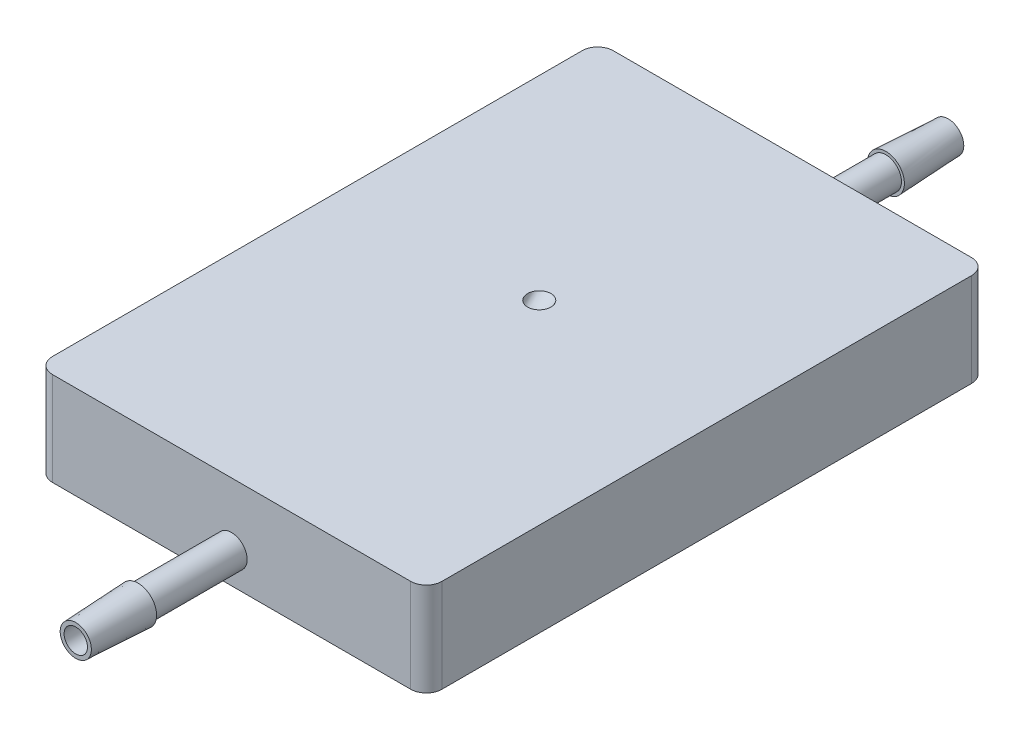
ISO-10303-21;
HEADER;
FILE_DESCRIPTION(('STEP AP214'),'2;1');
FILE_NAME('part.step','',(''),(''),'','','');
FILE_SCHEMA(('AUTOMOTIVE_DESIGN { 1 0 10303 214 1 1 1 1 }'));
ENDSEC;
DATA;
#1=APPLICATION_CONTEXT('core data for automotive mechanical design processes');
#2=APPLICATION_PROTOCOL_DEFINITION('international standard','automotive_design',2000,#1);
#3=PRODUCT_CONTEXT('',#1,'mechanical');
#4=PRODUCT('Part','Part','',(#3));
#5=PRODUCT_RELATED_PRODUCT_CATEGORY('part','',(#4));
#6=PRODUCT_DEFINITION_FORMATION('','',#4);
#7=PRODUCT_DEFINITION_CONTEXT('part definition',#1,'design');
#8=PRODUCT_DEFINITION('design','',#6,#7);
#9=PRODUCT_DEFINITION_SHAPE('','',#8);
#10=(LENGTH_UNIT() NAMED_UNIT(*) SI_UNIT(.MILLI.,.METRE.));
#11=(NAMED_UNIT(*) PLANE_ANGLE_UNIT() SI_UNIT($,.RADIAN.));
#12=(NAMED_UNIT(*) SI_UNIT($,.STERADIAN.) SOLID_ANGLE_UNIT());
#13=UNCERTAINTY_MEASURE_WITH_UNIT(LENGTH_MEASURE(1.E-05),#10,'distance_accuracy_value','');
#14=(GEOMETRIC_REPRESENTATION_CONTEXT(3) GLOBAL_UNCERTAINTY_ASSIGNED_CONTEXT((#13)) GLOBAL_UNIT_ASSIGNED_CONTEXT((#10,
#11,#12)) REPRESENTATION_CONTEXT('',''));
#15=CARTESIAN_POINT('',(0.,0.,0.));
#16=DIRECTION('',(0.,0.,1.));
#17=DIRECTION('',(1.,0.,0.));
#18=AXIS2_PLACEMENT_3D('',#15,#16,#17);
#19=CARTESIAN_POINT('',(0.,-8.07,56.));
#20=DIRECTION('',(0.,0.,-1.));
#21=DIRECTION('',(-1.,0.,0.));
#22=AXIS2_PLACEMENT_3D('',#19,#20,#21);
#23=CYLINDRICAL_SURFACE('',#22,2.);
#24=CARTESIAN_POINT('',(0.,-8.07,36.));
#25=DIRECTION('',(0.,0.,1.));
#26=DIRECTION('',(1.,0.,0.));
#27=AXIS2_PLACEMENT_3D('',#24,#25,#26);
#28=CIRCLE('',#27,2.);
#29=CARTESIAN_POINT('',(2.,-8.07,36.));
#30=VERTEX_POINT('',#29);
#31=EDGE_CURVE('E55',#30,#30,#28,.T.);
#32=ORIENTED_EDGE('',*,*,#31,.T.);
#33=EDGE_LOOP('',(#32));
#34=FACE_BOUND('',#33,.T.);
#35=CARTESIAN_POINT('',(0.,-8.07,48.));
#36=DIRECTION('',(0.,0.,1.));
#37=DIRECTION('',(1.,0.,0.));
#38=AXIS2_PLACEMENT_3D('',#35,#36,#37);
#39=CIRCLE('',#38,2.);
#40=CARTESIAN_POINT('',(2.,-8.07,48.));
#41=VERTEX_POINT('',#40);
#42=EDGE_CURVE('E12',#41,#41,#39,.T.);
#43=ORIENTED_EDGE('',*,*,#42,.F.);
#44=EDGE_LOOP('',(#43));
#45=FACE_BOUND('',#44,.T.);
#46=ADVANCED_FACE('F49',(#34,#45),#23,.T.);
#47=CARTESIAN_POINT('',(0.,-8.07,36.));
#48=DIRECTION('',(0.,0.,1.));
#49=DIRECTION('',(1.,0.,0.));
#50=AXIS2_PLACEMENT_3D('',#47,#48,#49);
#51=PLANE('',#50);
#52=CARTESIAN_POINT('',(0.,-8.07,36.));
#53=DIRECTION('',(0.,0.,1.));
#54=DIRECTION('',(1.,0.,0.));
#55=AXIS2_PLACEMENT_3D('',#52,#53,#54);
#56=CIRCLE('',#55,1.5);
#57=CARTESIAN_POINT('',(1.5,-8.07,36.));
#58=VERTEX_POINT('',#57);
#59=EDGE_CURVE('E70',#58,#58,#56,.T.);
#60=ORIENTED_EDGE('',*,*,#59,.T.);
#61=EDGE_LOOP('',(#60));
#62=FACE_BOUND('',#61,.T.);
#63=ORIENTED_EDGE('',*,*,#31,.F.);
#64=EDGE_LOOP('',(#63));
#65=FACE_BOUND('',#64,.T.);
#66=ADVANCED_FACE('F88',(#62,#65),#51,.F.);
#67=CARTESIAN_POINT('',(0.,-8.07,48.));
#68=DIRECTION('',(0.,0.,1.));
#69=DIRECTION('',(1.,0.,0.));
#70=AXIS2_PLACEMENT_3D('',#67,#68,#69);
#71=PLANE('',#70);
#72=ORIENTED_EDGE('',*,*,#42,.T.);
#73=EDGE_LOOP('',(#72));
#74=FACE_BOUND('',#73,.T.);
#75=CARTESIAN_POINT('',(0.,-8.07,48.));
#76=DIRECTION('',(0.,0.,1.));
#77=DIRECTION('',(1.,0.,0.));
#78=AXIS2_PLACEMENT_3D('',#75,#76,#77);
#79=CIRCLE('',#78,2.375);
#80=CARTESIAN_POINT('',(2.375,-8.07,48.));
#81=VERTEX_POINT('',#80);
#82=EDGE_CURVE('E63',#81,#81,#79,.T.);
#83=ORIENTED_EDGE('',*,*,#82,.F.);
#84=EDGE_LOOP('',(#83));
#85=FACE_BOUND('',#84,.T.);
#86=ADVANCED_FACE('F77',(#74,#85),#71,.F.);
#87=CARTESIAN_POINT('',(0.,-8.07,56.));
#88=DIRECTION('',(0.,0.,-1.));
#89=DIRECTION('',(-1.,0.,0.));
#90=AXIS2_PLACEMENT_3D('',#87,#88,#89);
#91=CONICAL_SURFACE('',#90,2.,0.0468407129159696);
#92=ORIENTED_EDGE('',*,*,#82,.T.);
#93=EDGE_LOOP('',(#92));
#94=FACE_BOUND('',#93,.T.);
#95=CARTESIAN_POINT('',(0.,-8.07,56.));
#96=DIRECTION('',(0.,0.,1.));
#97=DIRECTION('',(1.,0.,0.));
#98=AXIS2_PLACEMENT_3D('',#95,#96,#97);
#99=CIRCLE('',#98,2.);
#100=CARTESIAN_POINT('',(2.,-8.07,56.));
#101=VERTEX_POINT('',#100);
#102=EDGE_CURVE('E59',#101,#101,#99,.T.);
#103=ORIENTED_EDGE('',*,*,#102,.F.);
#104=EDGE_LOOP('',(#103));
#105=FACE_BOUND('',#104,.T.);
#106=ADVANCED_FACE('F87',(#94,#105),#91,.T.);
#107=CARTESIAN_POINT('',(0.,-8.07,56.));
#108=DIRECTION('',(0.,0.,1.));
#109=DIRECTION('',(1.,0.,0.));
#110=AXIS2_PLACEMENT_3D('',#107,#108,#109);
#111=PLANE('',#110);
#112=CARTESIAN_POINT('',(0.,-8.07,56.));
#113=DIRECTION('',(0.,0.,1.));
#114=DIRECTION('',(1.,0.,0.));
#115=AXIS2_PLACEMENT_3D('',#112,#113,#114);
#116=CIRCLE('',#115,1.5);
#117=CARTESIAN_POINT('',(1.5,-8.07,56.));
#118=VERTEX_POINT('',#117);
#119=EDGE_CURVE('E106',#118,#118,#116,.T.);
#120=ORIENTED_EDGE('',*,*,#119,.F.);
#121=EDGE_LOOP('',(#120));
#122=FACE_BOUND('',#121,.T.);
#123=ORIENTED_EDGE('',*,*,#102,.T.);
#124=EDGE_LOOP('',(#123));
#125=FACE_BOUND('',#124,.T.);
#126=ADVANCED_FACE('F93',(#122,#125),#111,.T.);
#127=CARTESIAN_POINT('',(0.,-8.07,-56.00002));
#128=DIRECTION('',(0.,0.,1.));
#129=DIRECTION('',(1.,0.,0.));
#130=AXIS2_PLACEMENT_3D('',#127,#128,#129);
#131=CYLINDRICAL_SURFACE('',#130,1.5);
#132=CARTESIAN_POINT('',(1.5,-8.07,56.));
#133=CARTESIAN_POINT('',(1.5,-8.07,55.7916666666667));
#134=CARTESIAN_POINT('',(1.5,-8.07,55.5833333333333));
#135=CARTESIAN_POINT('',(1.5,-8.07,55.1666666666667));
#136=CARTESIAN_POINT('',(1.5,-8.07,54.9583333333333));
#137=CARTESIAN_POINT('',(1.5,-8.07,54.5416666666667));
#138=CARTESIAN_POINT('',(1.5,-8.07,54.3333333333333));
#139=CARTESIAN_POINT('',(1.5,-8.07,53.9166666666667));
#140=CARTESIAN_POINT('',(1.5,-8.07,53.7083333333333));
#141=CARTESIAN_POINT('',(1.5,-8.07,53.2916666666667));
#142=CARTESIAN_POINT('',(1.5,-8.07,53.0833333333333));
#143=CARTESIAN_POINT('',(1.5,-8.07,52.6666666666667));
#144=CARTESIAN_POINT('',(1.5,-8.07,52.4583333333333));
#145=CARTESIAN_POINT('',(1.5,-8.07,52.0416666666667));
#146=CARTESIAN_POINT('',(1.5,-8.07,51.8333333333333));
#147=CARTESIAN_POINT('',(1.5,-8.07,51.4166666666667));
#148=CARTESIAN_POINT('',(1.5,-8.07,51.2083333333333));
#149=CARTESIAN_POINT('',(1.5,-8.07,50.7916666666667));
#150=CARTESIAN_POINT('',(1.5,-8.07,50.5833333333333));
#151=CARTESIAN_POINT('',(1.5,-8.07,50.1666666666667));
#152=CARTESIAN_POINT('',(1.5,-8.07,49.9583333333333));
#153=CARTESIAN_POINT('',(1.5,-8.07,49.5416666666667));
#154=CARTESIAN_POINT('',(1.5,-8.07,49.3333333333333));
#155=CARTESIAN_POINT('',(1.5,-8.07,48.9166666666667));
#156=CARTESIAN_POINT('',(1.5,-8.07,48.7083333333333));
#157=CARTESIAN_POINT('',(1.5,-8.07,48.2916666666667));
#158=CARTESIAN_POINT('',(1.5,-8.07,48.0833333333333));
#159=CARTESIAN_POINT('',(1.5,-8.07,47.6666666666667));
#160=CARTESIAN_POINT('',(1.5,-8.07,47.4583333333333));
#161=CARTESIAN_POINT('',(1.5,-8.07,47.0416666666667));
#162=CARTESIAN_POINT('',(1.5,-8.07,46.8333333333333));
#163=CARTESIAN_POINT('',(1.5,-8.07,46.4166666666667));
#164=CARTESIAN_POINT('',(1.5,-8.07,46.2083333333333));
#165=CARTESIAN_POINT('',(1.5,-8.07,45.7916666666667));
#166=CARTESIAN_POINT('',(1.5,-8.07,45.5833333333333));
#167=CARTESIAN_POINT('',(1.5,-8.07,45.1666666666667));
#168=CARTESIAN_POINT('',(1.5,-8.07,44.9583333333333));
#169=CARTESIAN_POINT('',(1.5,-8.07,44.5416666666667));
#170=CARTESIAN_POINT('',(1.5,-8.07,44.3333333333333));
#171=CARTESIAN_POINT('',(1.5,-8.07,43.9166666666667));
#172=CARTESIAN_POINT('',(1.5,-8.07,43.7083333333333));
#173=CARTESIAN_POINT('',(1.5,-8.07,43.2916666666667));
#174=CARTESIAN_POINT('',(1.5,-8.07,43.0833333333333));
#175=CARTESIAN_POINT('',(1.5,-8.07,42.6666666666667));
#176=CARTESIAN_POINT('',(1.5,-8.07,42.4583333333333));
#177=CARTESIAN_POINT('',(1.5,-8.07,42.0416666666667));
#178=CARTESIAN_POINT('',(1.5,-8.07,41.8333333333333));
#179=CARTESIAN_POINT('',(1.5,-8.07,41.4166666666667));
#180=CARTESIAN_POINT('',(1.5,-8.07,41.2083333333333));
#181=CARTESIAN_POINT('',(1.5,-8.07,40.7916666666667));
#182=CARTESIAN_POINT('',(1.5,-8.07,40.5833333333333));
#183=CARTESIAN_POINT('',(1.5,-8.07,40.1666666666667));
#184=CARTESIAN_POINT('',(1.5,-8.07,39.9583333333333));
#185=CARTESIAN_POINT('',(1.5,-8.07,39.5416666666667));
#186=CARTESIAN_POINT('',(1.5,-8.07,39.3333333333333));
#187=CARTESIAN_POINT('',(1.5,-8.07,38.9166666666667));
#188=CARTESIAN_POINT('',(1.5,-8.07,38.7083333333333));
#189=CARTESIAN_POINT('',(1.5,-8.07,38.2916666666667));
#190=CARTESIAN_POINT('',(1.5,-8.07,38.0833333333333));
#191=CARTESIAN_POINT('',(1.5,-8.07,37.6666666666667));
#192=CARTESIAN_POINT('',(1.5,-8.07,37.4583333333333));
#193=CARTESIAN_POINT('',(1.5,-8.07,37.0416666666667));
#194=CARTESIAN_POINT('',(1.5,-8.07,36.8333333333333));
#195=CARTESIAN_POINT('',(1.5,-8.07,36.4166666666667));
#196=CARTESIAN_POINT('',(1.5,-8.07,36.2083333333333));
#197=CARTESIAN_POINT('',(1.5,-8.07,36.));
#198=B_SPLINE_CURVE_WITH_KNOTS('',3,(#132,#133,#134,#135,#136,#137,#138,#139,#140,#141,#142,
#143,#144,#145,#146,#147,#148,#149,#150,#151,#152,#153,#154,#155,#156,#157,#158,#159,#160,#161,
#162,#163,#164,#165,#166,#167,#168,#169,#170,#171,#172,#173,#174,#175,#176,#177,#178,#179,#180,
#181,#182,#183,#184,#185,#186,#187,#188,#189,#190,#191,#192,#193,#194,#195,#196,#197),
.UNSPECIFIED.,.F.,.F.,(4,2,2,2,2,2,2,2,2,2,2,2,2,2,2,2,2,2,2,2,2,2,2,2,2,2,2,2,2,2,2,2,4),(0.,
0.625000000000001,1.25,1.875,2.5,3.125,3.75,4.375,5.,5.62499999999999,6.24999999999999,
6.87499999999999,7.49999999999999,8.12499999999999,8.74999999999999,9.37499999999999,
9.99999999999999,10.625,11.25,11.875,12.5,13.125,13.75,14.375,15.,15.625,16.25,16.875,17.5,
18.125,18.75,19.375,20.),.UNSPECIFIED.);
#199=EDGE_CURVE('BSEAM89',#118,#58,#198,.T.);
#200=ORIENTED_EDGE('',*,*,#119,.T.);
#201=ORIENTED_EDGE('',*,*,#59,.F.);
#202=ORIENTED_EDGE('',*,*,#199,.T.);
#203=ORIENTED_EDGE('',*,*,#199,.F.);
#204=EDGE_LOOP('',(#200,#202,#201,#203));
#205=FACE_BOUND('',#204,.T.);
#206=ADVANCED_FACE('F89',(#205),#131,.F.);
#207=CLOSED_SHELL('',(#46,#66,#86,#106,#126,#206));
#208=MANIFOLD_SOLID_BREP('B2',#207);
#209=CARTESIAN_POINT('',(0.,-7.07106781186549,3.57106781186547));
#210=DIRECTION('',(0.,-1.,0.));
#211=DIRECTION('',(0.,0.,-1.));
#212=AXIS2_PLACEMENT_3D('',#209,#210,#211);
#213=PLANE('',#212);
#214=CARTESIAN_POINT('',(0.,-7.07106781186549,3.57106781186547));
#215=DIRECTION('',(0.,-1.,0.));
#216=DIRECTION('',(0.,0.,-1.));
#217=AXIS2_PLACEMENT_3D('',#214,#215,#216);
#218=CIRCLE('',#217,1.5);
#219=CARTESIAN_POINT('',(1.11898815163914,-7.07106781186549,2.57213562373096));
#220=VERTEX_POINT('',#219);
#221=CARTESIAN_POINT('',(1.11898815163914,-7.07106781186549,4.56999999999999));
#222=VERTEX_POINT('',#221);
#223=EDGE_CURVE('E253',#220,#222,#218,.T.);
#224=ORIENTED_EDGE('',*,*,#223,.F.);
#225=DIRECTION('',(0.,0.,1.));
#226=VECTOR('',#225,1.);
#227=CARTESIAN_POINT('',(1.11898815163914,-7.07106781186549,-56.00002));
#228=LINE('',#227,#226);
#229=EDGE_CURVE('E244',#220,#222,#228,.T.);
#230=ORIENTED_EDGE('',*,*,#229,.T.);
#231=EDGE_LOOP('',(#224,#230));
#232=FACE_BOUND('',#231,.T.);
#233=ADVANCED_FACE('F163',(#232),#213,.F.);
#234=CARTESIAN_POINT('',(0.,-12.,36.));
#235=DIRECTION('',(0.,0.,1.));
#236=DIRECTION('',(1.,0.,0.));
#237=AXIS2_PLACEMENT_3D('',#234,#235,#236);
#238=PLANE('',#237);
#239=CARTESIAN_POINT('',(0.,-8.07,36.));
#240=DIRECTION('',(0.,0.,1.));
#241=DIRECTION('',(1.,0.,0.));
#242=AXIS2_PLACEMENT_3D('',#239,#240,#241);
#243=CIRCLE('',#242,1.5);
#244=CARTESIAN_POINT('',(1.5,-8.07,36.));
#245=VERTEX_POINT('',#244);
#246=EDGE_CURVE('E343',#245,#245,#243,.T.);
#247=ORIENTED_EDGE('',*,*,#246,.F.);
#248=EDGE_LOOP('',(#247));
#249=FACE_BOUND('',#248,.T.);
#250=DIRECTION('',(1.,0.,0.));
#251=VECTOR('',#250,1.);
#252=CARTESIAN_POINT('',(0.,-12.,36.));
#253=LINE('',#252,#251);
#254=CARTESIAN_POINT('',(-23.,-12.,36.));
#255=VERTEX_POINT('',#254);
#256=CARTESIAN_POINT('',(23.,-12.,36.));
#257=VERTEX_POINT('',#256);
#258=EDGE_CURVE('E274',#255,#257,#253,.T.);
#259=ORIENTED_EDGE('',*,*,#258,.T.);
#260=DIRECTION('',(0.,1.,0.));
#261=VECTOR('',#260,1.);
#262=CARTESIAN_POINT('',(23.,-12.,36.));
#263=LINE('',#262,#261);
#264=CARTESIAN_POINT('',(23.,0.,36.));
#265=VERTEX_POINT('',#264);
#266=EDGE_CURVE('E172',#257,#265,#263,.T.);
#267=ORIENTED_EDGE('',*,*,#266,.T.);
#268=DIRECTION('',(1.,0.,0.));
#269=VECTOR('',#268,1.);
#270=CARTESIAN_POINT('',(0.,0.,36.));
#271=LINE('',#270,#269);
#272=CARTESIAN_POINT('',(-23.,0.,36.));
#273=VERTEX_POINT('',#272);
#274=EDGE_CURVE('E262',#273,#265,#271,.T.);
#275=ORIENTED_EDGE('',*,*,#274,.F.);
#276=DIRECTION('',(0.,1.,0.));
#277=VECTOR('',#276,1.);
#278=CARTESIAN_POINT('',(-23.,-12.,36.));
#279=LINE('',#278,#277);
#280=EDGE_CURVE('E389',#273,#255,#279,.F.);
#281=ORIENTED_EDGE('',*,*,#280,.T.);
#282=EDGE_LOOP('',(#259,#267,#275,#281));
#283=FACE_BOUND('',#282,.T.);
#284=ADVANCED_FACE('F295',(#249,#283),#238,.T.);
#285=CARTESIAN_POINT('',(-25.,-12.,0.));
#286=DIRECTION('',(1.,0.,0.));
#287=DIRECTION('',(0.,0.,-1.));
#288=AXIS2_PLACEMENT_3D('',#285,#286,#287);
#289=PLANE('',#288);
#290=DIRECTION('',(0.,0.,-1.));
#291=VECTOR('',#290,1.);
#292=CARTESIAN_POINT('',(-25.,0.,0.));
#293=LINE('',#292,#291);
#294=CARTESIAN_POINT('',(-25.,0.,34.));
#295=VERTEX_POINT('',#294);
#296=CARTESIAN_POINT('',(-25.,0.,-34.));
#297=VERTEX_POINT('',#296);
#298=EDGE_CURVE('E392',#295,#297,#293,.T.);
#299=ORIENTED_EDGE('',*,*,#298,.T.);
#300=DIRECTION('',(0.,1.,0.));
#301=VECTOR('',#300,1.);
#302=CARTESIAN_POINT('',(-25.,-12.,-34.));
#303=LINE('',#302,#301);
#304=CARTESIAN_POINT('',(-25.,-12.,-34.));
#305=VERTEX_POINT('',#304);
#306=EDGE_CURVE('E435',#297,#305,#303,.F.);
#307=ORIENTED_EDGE('',*,*,#306,.T.);
#308=DIRECTION('',(0.,0.,-1.));
#309=VECTOR('',#308,1.);
#310=CARTESIAN_POINT('',(-25.,-12.,0.));
#311=LINE('',#310,#309);
#312=CARTESIAN_POINT('',(-25.,-12.,34.));
#313=VERTEX_POINT('',#312);
#314=EDGE_CURVE('E416',#313,#305,#311,.T.);
#315=ORIENTED_EDGE('',*,*,#314,.F.);
#316=DIRECTION('',(0.,1.,0.));
#317=VECTOR('',#316,1.);
#318=CARTESIAN_POINT('',(-25.,0.,34.));
#319=LINE('',#318,#317);
#320=EDGE_CURVE('E432',#313,#295,#319,.T.);
#321=ORIENTED_EDGE('',*,*,#320,.T.);
#322=EDGE_LOOP('',(#299,#307,#315,#321));
#323=FACE_BOUND('',#322,.T.);
#324=ADVANCED_FACE('F291',(#323),#289,.F.);
#325=CARTESIAN_POINT('',(0.,-12.,-36.));
#326=DIRECTION('',(0.,0.,1.));
#327=DIRECTION('',(1.,0.,0.));
#328=AXIS2_PLACEMENT_3D('',#325,#326,#327);
#329=PLANE('',#328);
#330=CARTESIAN_POINT('',(0.,-8.07,-36.));
#331=DIRECTION('',(0.,0.,1.));
#332=DIRECTION('',(1.,0.,0.));
#333=AXIS2_PLACEMENT_3D('',#330,#331,#332);
#334=CIRCLE('',#333,2.);
#335=CARTESIAN_POINT('',(2.,-8.07,-36.));
#336=VERTEX_POINT('',#335);
#337=EDGE_CURVE('E47',#336,#336,#334,.F.);
#338=ORIENTED_EDGE('',*,*,#337,.F.);
#339=EDGE_LOOP('',(#338));
#340=FACE_BOUND('',#339,.T.);
#341=DIRECTION('',(1.,0.,0.));
#342=VECTOR('',#341,1.);
#343=CARTESIAN_POINT('',(0.,-12.,-36.));
#344=LINE('',#343,#342);
#345=CARTESIAN_POINT('',(-23.,-12.,-36.));
#346=VERTEX_POINT('',#345);
#347=CARTESIAN_POINT('',(23.,-12.,-36.));
#348=VERTEX_POINT('',#347);
#349=EDGE_CURVE('E409',#346,#348,#344,.T.);
#350=ORIENTED_EDGE('',*,*,#349,.F.);
#351=DIRECTION('',(0.,1.,0.));
#352=VECTOR('',#351,1.);
#353=CARTESIAN_POINT('',(-23.,-12.,-36.));
#354=LINE('',#353,#352);
#355=CARTESIAN_POINT('',(-23.,0.,-36.));
#356=VERTEX_POINT('',#355);
#357=EDGE_CURVE('E412',#346,#356,#354,.T.);
#358=ORIENTED_EDGE('',*,*,#357,.T.);
#359=DIRECTION('',(1.,0.,0.));
#360=VECTOR('',#359,1.);
#361=CARTESIAN_POINT('',(0.,0.,-36.));
#362=LINE('',#361,#360);
#363=CARTESIAN_POINT('',(23.,0.,-36.));
#364=VERTEX_POINT('',#363);
#365=EDGE_CURVE('E449',#356,#364,#362,.T.);
#366=ORIENTED_EDGE('',*,*,#365,.T.);
#367=DIRECTION('',(0.,1.,0.));
#368=VECTOR('',#367,1.);
#369=CARTESIAN_POINT('',(23.,-12.,-36.));
#370=LINE('',#369,#368);
#371=EDGE_CURVE('E415',#364,#348,#370,.F.);
#372=ORIENTED_EDGE('',*,*,#371,.T.);
#373=EDGE_LOOP('',(#350,#358,#366,#372));
#374=FACE_BOUND('',#373,.T.);
#375=ADVANCED_FACE('F294',(#340,#374),#329,.F.);
#376=CARTESIAN_POINT('',(25.,-12.,0.));
#377=DIRECTION('',(1.,0.,0.));
#378=DIRECTION('',(0.,0.,-1.));
#379=AXIS2_PLACEMENT_3D('',#376,#377,#378);
#380=PLANE('',#379);
#381=DIRECTION('',(0.,0.,-1.));
#382=VECTOR('',#381,1.);
#383=CARTESIAN_POINT('',(25.,-12.,0.));
#384=LINE('',#383,#382);
#385=CARTESIAN_POINT('',(25.,-12.,34.));
#386=VERTEX_POINT('',#385);
#387=CARTESIAN_POINT('',(25.,-12.,-34.));
#388=VERTEX_POINT('',#387);
#389=EDGE_CURVE('E391',#386,#388,#384,.T.);
#390=ORIENTED_EDGE('',*,*,#389,.T.);
#391=DIRECTION('',(0.,1.,0.));
#392=VECTOR('',#391,1.);
#393=CARTESIAN_POINT('',(25.,0.,-34.));
#394=LINE('',#393,#392);
#395=CARTESIAN_POINT('',(25.,0.,-34.));
#396=VERTEX_POINT('',#395);
#397=EDGE_CURVE('E397',#388,#396,#394,.T.);
#398=ORIENTED_EDGE('',*,*,#397,.T.);
#399=DIRECTION('',(0.,0.,-1.));
#400=VECTOR('',#399,1.);
#401=CARTESIAN_POINT('',(25.,0.,0.));
#402=LINE('',#401,#400);
#403=CARTESIAN_POINT('',(25.,0.,34.));
#404=VERTEX_POINT('',#403);
#405=EDGE_CURVE('E447',#404,#396,#402,.T.);
#406=ORIENTED_EDGE('',*,*,#405,.F.);
#407=DIRECTION('',(0.,1.,0.));
#408=VECTOR('',#407,1.);
#409=CARTESIAN_POINT('',(25.,-12.,34.));
#410=LINE('',#409,#408);
#411=EDGE_CURVE('E442',#404,#386,#410,.F.);
#412=ORIENTED_EDGE('',*,*,#411,.T.);
#413=EDGE_LOOP('',(#390,#398,#406,#412));
#414=FACE_BOUND('',#413,.T.);
#415=ADVANCED_FACE('F286',(#414),#380,.T.);
#416=CARTESIAN_POINT('',(0.,-12.,0.));
#417=DIRECTION('',(0.,1.,0.));
#418=DIRECTION('',(0.,0.,1.));
#419=AXIS2_PLACEMENT_3D('',#416,#417,#418);
#420=PLANE('',#419);
#421=ORIENTED_EDGE('',*,*,#314,.T.);
#422=CARTESIAN_POINT('',(-23.,-12.,-34.));
#423=DIRECTION('',(0.,1.,0.));
#424=DIRECTION('',(0.,0.,1.));
#425=AXIS2_PLACEMENT_3D('',#422,#423,#424);
#426=CIRCLE('',#425,2.);
#427=EDGE_CURVE('E420',#305,#346,#426,.F.);
#428=ORIENTED_EDGE('',*,*,#427,.T.);
#429=ORIENTED_EDGE('',*,*,#349,.T.);
#430=CARTESIAN_POINT('',(23.,-12.,-34.));
#431=DIRECTION('',(0.,1.,0.));
#432=DIRECTION('',(0.,0.,1.));
#433=AXIS2_PLACEMENT_3D('',#430,#431,#432);
#434=CIRCLE('',#433,2.);
#435=EDGE_CURVE('E188',#348,#388,#434,.F.);
#436=ORIENTED_EDGE('',*,*,#435,.T.);
#437=ORIENTED_EDGE('',*,*,#389,.F.);
#438=CARTESIAN_POINT('',(23.,-12.,34.));
#439=DIRECTION('',(0.,1.,0.));
#440=DIRECTION('',(0.,0.,1.));
#441=AXIS2_PLACEMENT_3D('',#438,#439,#440);
#442=CIRCLE('',#441,2.);
#443=EDGE_CURVE('E394',#386,#257,#442,.F.);
#444=ORIENTED_EDGE('',*,*,#443,.T.);
#445=ORIENTED_EDGE('',*,*,#258,.F.);
#446=CARTESIAN_POINT('',(-23.,-12.,34.));
#447=DIRECTION('',(0.,1.,0.));
#448=DIRECTION('',(0.,0.,1.));
#449=AXIS2_PLACEMENT_3D('',#446,#447,#448);
#450=CIRCLE('',#449,2.);
#451=EDGE_CURVE('E437',#255,#313,#450,.F.);
#452=ORIENTED_EDGE('',*,*,#451,.T.);
#453=EDGE_LOOP('',(#421,#428,#429,#436,#437,#444,#445,#452));
#454=FACE_BOUND('',#453,.T.);
#455=ADVANCED_FACE('F282',(#454),#420,.F.);
#456=CARTESIAN_POINT('',(0.,0.,0.));
#457=DIRECTION('',(0.,1.,0.));
#458=DIRECTION('',(0.,0.,1.));
#459=AXIS2_PLACEMENT_3D('',#456,#457,#458);
#460=PLANE('',#459);
#461=CARTESIAN_POINT('',(0.,0.,-4.99999999999999));
#462=CARTESIAN_POINT('',(0.0780814625814367,0.,-4.999997819174));
#463=CARTESIAN_POINT('',(0.156194837180258,0.,-4.99388674339786));
#464=CARTESIAN_POINT('',(0.310568766075918,0.,-4.96957942884071));
#465=CARTESIAN_POINT('',(0.386827564864533,0.,-4.95137216884005));
#466=CARTESIAN_POINT('',(0.541460812921258,0.,-4.90140152427333));
#467=CARTESIAN_POINT('',(0.619529009389053,0.,-4.8686835768798));
#468=CARTESIAN_POINT('',(0.769060109938279,0.,-4.79060585046049));
#469=CARTESIAN_POINT('',(0.840522714355423,0.,-4.74524549828339));
#470=CARTESIAN_POINT('',(0.974819200377668,0.,-4.64317107606942));
#471=CARTESIAN_POINT('',(1.03765320584079,0.,-4.58645716903428));
#472=CARTESIAN_POINT('',(1.15290630501183,0.,-4.46328648096786));
#473=CARTESIAN_POINT('',(1.20532557189621,0.,-4.3968298619705));
#474=CARTESIAN_POINT('',(1.29826350116876,0.,-4.25605904936886));
#475=CARTESIAN_POINT('',(1.33878209527155,0.,-4.18174481068136));
#476=CARTESIAN_POINT('',(1.40676805357938,0.,-4.02736824492183));
#477=CARTESIAN_POINT('',(1.43423535051751,0.,-3.94730588822622));
#478=CARTESIAN_POINT('',(1.47533869888931,0.,-3.78370632167074));
#479=CARTESIAN_POINT('',(1.48897477619881,0.,-3.70016911831201));
#480=CARTESIAN_POINT('',(1.50202866391522,0.,-3.5319912169947));
#481=CARTESIAN_POINT('',(1.50144649440334,0.,-3.44735052059482));
#482=CARTESIAN_POINT('',(1.48608046369324,0.,-3.27936816894603));
#483=CARTESIAN_POINT('',(1.47129659490999,0.,-3.19602651439096));
#484=CARTESIAN_POINT('',(1.42794681627332,0.,-3.03300808865591));
#485=CARTESIAN_POINT('',(1.39938090167607,0.,-2.95333131873741));
#486=CARTESIAN_POINT('',(1.329277937295,0.,-2.79990449325223));
#487=CARTESIAN_POINT('',(1.28774088927041,0.,-2.72615443688173));
#488=CARTESIAN_POINT('',(1.19287477465275,0.,-2.58667457911823));
#489=CARTESIAN_POINT('',(1.13954570891943,0.,-2.52094477714047));
#490=CARTESIAN_POINT('',(1.02260941097157,0.,-2.39937129554527));
#491=CARTESIAN_POINT('',(0.959002178452054,0.,-2.3435276162212));
#492=CARTESIAN_POINT('',(0.823315169208855,0.,-2.24331161973099));
#493=CARTESIAN_POINT('',(0.751235392370483,0.,-2.19893930272014));
#494=CARTESIAN_POINT('',(0.600649428506405,0.,-2.12292563140233));
#495=CARTESIAN_POINT('',(0.522143241499197,0.,-2.09128427705873));
#496=CARTESIAN_POINT('',(0.360933017523727,0.,-2.04163073623709));
#497=CARTESIAN_POINT('',(0.278228980588287,0.,-2.02361854965249));
#498=CARTESIAN_POINT('',(0.110970781472903,0.,-2.00173465699344));
#499=CARTESIAN_POINT('',(0.0264166193111619,0.,-1.99786295077986));
#500=CARTESIAN_POINT('',(-0.14214158937849,0.,-2.00436992495797));
#501=CARTESIAN_POINT('',(-0.22614563589128,0.,-2.01474860574132));
#502=CARTESIAN_POINT('',(-0.391218985967424,0.,-2.04946173495449));
#503=CARTESIAN_POINT('',(-0.472288289425148,0.,-2.07379618388661));
#504=CARTESIAN_POINT('',(-0.629190822929284,0.,-2.13573006325163));
#505=CARTESIAN_POINT('',(-0.705024053496428,0.,-2.17332949236533));
#506=CARTESIAN_POINT('',(-0.849301760195755,0.,-2.26072599052401));
#507=CARTESIAN_POINT('',(-0.917746237118822,0.,-2.31052305826339));
#508=CARTESIAN_POINT('',(-1.04530352889115,0.,-2.42090126143768));
#509=CARTESIAN_POINT('',(-1.1044163408143,0.,-2.48148240025413));
#510=CARTESIAN_POINT('',(-1.21163225108473,0.,-2.6117090304441));
#511=CARTESIAN_POINT('',(-1.25973534664264,0.,-2.68135452411413));
#512=CARTESIAN_POINT('',(-1.34356626354156,0.,-2.82773275956024));
#513=CARTESIAN_POINT('',(-1.37929409503359,0.,-2.90446549552283));
#514=CARTESIAN_POINT('',(-1.43736032342614,0.,-3.06284002547027));
#515=CARTESIAN_POINT('',(-1.45969872426642,0.,-3.14448181801064));
#516=CARTESIAN_POINT('',(-1.49035200766799,0.,-3.31035703210246));
#517=CARTESIAN_POINT('',(-1.49866687047423,0.,-3.3945904573046));
#518=CARTESIAN_POINT('',(-1.50103698330676,0.,-3.56325756039939));
#519=CARTESIAN_POINT('',(-1.4950922540952,0.,-3.6476912380003));
#520=CARTESIAN_POINT('',(-1.46911194804978,0.,-3.81436227427137));
#521=CARTESIAN_POINT('',(-1.44907635003292,0.,-3.89659962963958));
#522=CARTESIAN_POINT('',(-1.39548269468948,0.,-4.0565445572966));
#523=CARTESIAN_POINT('',(-1.36192444327949,0.,-4.1342520645526));
#524=CARTESIAN_POINT('',(-1.28223915813427,0.,-4.28292782899874));
#525=CARTESIAN_POINT('',(-1.23611250411696,0.,-4.35389628970232));
#526=CARTESIAN_POINT('',(-1.13260418417827,0.,-4.48707661900277));
#527=CARTESIAN_POINT('',(-1.07522342812459,0.,-4.5492891947944));
#528=CARTESIAN_POINT('',(-0.950818733008898,0.,-4.66321010723415));
#529=CARTESIAN_POINT('',(-0.883792945978387,0.,-4.71491642631497));
#530=CARTESIAN_POINT('',(-0.741992094516134,0.,-4.80635765737475));
#531=CARTESIAN_POINT('',(-0.667214177825336,0.,-4.84608814189752));
#532=CARTESIAN_POINT('',(-0.512093226880883,0.,-4.91239587394726));
#533=CARTESIAN_POINT('',(-0.4317554326849,0.,-4.93898531921571));
#534=CARTESIAN_POINT('',(-0.292566039841705,0.,-4.97237135906569));
#535=CARTESIAN_POINT('',(-0.234539792646403,0.,-4.98271853485402));
#536=CARTESIAN_POINT('',(-0.117681641889038,0.,-4.99653305933841));
#537=CARTESIAN_POINT('',(-0.0588498849387602,0.,-5.00000164368536));
#538=CARTESIAN_POINT('',(0.,0.,-4.99999999999999));
#539=B_SPLINE_CURVE_WITH_KNOTS('',3,(#461,#462,#463,#464,#465,#466,#467,#468,#469,#470,#471,
#472,#473,#474,#475,#476,#477,#478,#479,#480,#481,#482,#483,#484,#485,#486,#487,#488,#489,#490,
#491,#492,#493,#494,#495,#496,#497,#498,#499,#500,#501,#502,#503,#504,#505,#506,#507,#508,#509,
#510,#511,#512,#513,#514,#515,#516,#517,#518,#519,#520,#521,#522,#523,#524,#525,#526,#527,#528,
#529,#530,#531,#532,#533,#534,#535,#536,#537,#538),.UNSPECIFIED.,.T.,.F.,(4,2,2,2,2,2,2,2,2,2,2,
2,2,2,2,2,2,2,2,2,2,2,2,2,2,2,2,2,2,2,2,2,2,2,2,2,2,2,4),(0.,0.234060069342365,
0.468333691296653,0.721054859125771,0.973787486091065,1.22651648486197,1.4792412808989,
1.73196752702772,1.98469507570354,2.23742215156854,2.49014887049333,2.74287572439778,
2.99560266529155,3.24832957190882,3.50105646009996,3.75378335579051,4.00651025490219,
4.25923715328646,4.5119640496947,4.7646909436165,5.01741784448438,5.2701447544486,
5.52287163927891,5.7755984970576,6.02832543408343,6.28105243513921,6.53377922889095,
6.78650594827929,7.03923302368504,7.29195973111701,7.5446868184775,7.79741753322426,
8.0501406132906,8.30284326970632,8.55559440806732,8.8084388740326,9.06104820249384,
9.23749063529472,9.41390136959916),.UNSPECIFIED.);
#540=CARTESIAN_POINT('',(0.,0.,-4.99999999999999));
#541=VERTEX_POINT('',#540);
#542=EDGE_CURVE('E258',#541,#541,#539,.T.);
#543=ORIENTED_EDGE('',*,*,#542,.T.);
#544=EDGE_LOOP('',(#543));
#545=FACE_BOUND('',#544,.T.);
#546=ORIENTED_EDGE('',*,*,#365,.F.);
#547=CARTESIAN_POINT('',(-23.,0.,-34.));
#548=DIRECTION('',(0.,1.,0.));
#549=DIRECTION('',(0.,0.,1.));
#550=AXIS2_PLACEMENT_3D('',#547,#548,#549);
#551=CIRCLE('',#550,2.);
#552=EDGE_CURVE('E421',#356,#297,#551,.T.);
#553=ORIENTED_EDGE('',*,*,#552,.T.);
#554=ORIENTED_EDGE('',*,*,#298,.F.);
#555=CARTESIAN_POINT('',(-23.,0.,34.));
#556=DIRECTION('',(0.,1.,0.));
#557=DIRECTION('',(0.,0.,1.));
#558=AXIS2_PLACEMENT_3D('',#555,#556,#557);
#559=CIRCLE('',#558,2.);
#560=EDGE_CURVE('E422',#295,#273,#559,.T.);
#561=ORIENTED_EDGE('',*,*,#560,.T.);
#562=ORIENTED_EDGE('',*,*,#274,.T.);
#563=CARTESIAN_POINT('',(23.,0.,34.));
#564=DIRECTION('',(0.,1.,0.));
#565=DIRECTION('',(0.,0.,1.));
#566=AXIS2_PLACEMENT_3D('',#563,#564,#565);
#567=CIRCLE('',#566,2.);
#568=EDGE_CURVE('E395',#265,#404,#567,.T.);
#569=ORIENTED_EDGE('',*,*,#568,.T.);
#570=ORIENTED_EDGE('',*,*,#405,.T.);
#571=CARTESIAN_POINT('',(23.,0.,-34.));
#572=DIRECTION('',(0.,1.,0.));
#573=DIRECTION('',(0.,0.,1.));
#574=AXIS2_PLACEMENT_3D('',#571,#572,#573);
#575=CIRCLE('',#574,2.);
#576=EDGE_CURVE('E429',#396,#364,#575,.T.);
#577=ORIENTED_EDGE('',*,*,#576,.T.);
#578=EDGE_LOOP('',(#546,#553,#554,#561,#562,#569,#570,#577));
#579=FACE_BOUND('',#578,.T.);
#580=ADVANCED_FACE('F285',(#545,#579),#460,.T.);
#581=CARTESIAN_POINT('',(-1.11898815163914,-7.07106781186549,4.56999999999999));
#582=VERTEX_POINT('',#581);
#583=CARTESIAN_POINT('',(-1.11898815163914,-7.07106781186549,2.57213562373096));
#584=VERTEX_POINT('',#583);
#585=EDGE_CURVE('E259',#582,#584,#218,.T.);
#586=ORIENTED_EDGE('',*,*,#585,.F.);
#587=DIRECTION('',(0.,0.,1.));
#588=VECTOR('',#587,1.);
#589=CARTESIAN_POINT('',(-1.11898815163914,-7.07106781186549,-56.00002));
#590=LINE('',#589,#588);
#591=EDGE_CURVE('E180',#582,#584,#590,.F.);
#592=ORIENTED_EDGE('',*,*,#591,.T.);
#593=EDGE_LOOP('',(#586,#592));
#594=FACE_BOUND('',#593,.T.);
#595=ADVANCED_FACE('F289',(#594),#213,.F.);
#596=CARTESIAN_POINT('',(0.,1.05779041144829,-6.05779041144828));
#597=CARTESIAN_POINT('',(0.,-7.07106781186549,2.07106781186548));
#598=CARTESIAN_POINT('',(3.,1.05779041144829,-6.05779041144828));
#599=CARTESIAN_POINT('',(3.,-7.07106781186549,2.07106781186547));
#600=CARTESIAN_POINT('',(3.,1.05779041144829,-3.05779041144828));
#601=CARTESIAN_POINT('',(3.,-7.07106781186549,5.07106781186548));
#602=CARTESIAN_POINT('',(0.,1.05779041144829,-3.05779041144828));
#603=CARTESIAN_POINT('',(0.,-7.07106781186549,5.07106781186548));
#604=CARTESIAN_POINT('',(-3.,1.05779041144829,-3.05779041144828));
#605=CARTESIAN_POINT('',(-3.,-7.07106781186549,5.07106781186548));
#606=CARTESIAN_POINT('',(-3.,1.05779041144829,-6.05779041144828));
#607=CARTESIAN_POINT('',(-3.,-7.07106781186549,2.07106781186547));
#608=CARTESIAN_POINT('',(0.,1.05779041144829,-6.05779041144828));
#609=CARTESIAN_POINT('',(0.,-7.07106781186549,2.07106781186548));
#610=(BOUNDED_SURFACE() B_SPLINE_SURFACE(3,1,((#596,#597),(#598,#599),(#600,#601),(#602,#603),
(#604,#605),(#606,#607),(#608,#609)),.UNSPECIFIED.,.T.,.F.,.F.) B_SPLINE_SURFACE_WITH_KNOTS((4,
3,4),(2,2),(0.,0.5,1.),(0.,1.),
.UNSPECIFIED.) GEOMETRIC_REPRESENTATION_ITEM() RATIONAL_B_SPLINE_SURFACE(((1.,1.),
(0.333333333333333,0.333333333333333),(0.333333333333333,0.333333333333333),(1.,1.),
(0.333333333333333,0.333333333333333),(0.333333333333333,0.333333333333333),(1.,1.))) REPRESENTATION_ITEM('') SURFACE());
#611=CARTESIAN_POINT('',(-1.11898815163914,-7.07106781186549,2.57213562373096));
#612=CARTESIAN_POINT('',(-1.10001979332297,-7.04983220684902,2.52966441369858));
#613=CARTESIAN_POINT('',(-1.08012752335164,-7.02875507044038,2.48751014088103));
#614=CARTESIAN_POINT('',(-1.03809846186699,-6.98683469129624,2.40366938259219));
#615=CARTESIAN_POINT('',(-1.01594371706751,-6.96599505715681,2.36199011431305));
#616=CARTESIAN_POINT('',(-0.969235926758011,-6.92476912092767,2.27953824185588));
#617=CARTESIAN_POINT('',(-0.944675096511523,-6.90438457112557,2.23876914225308));
#618=CARTESIAN_POINT('',(-0.89227961197632,-6.86378109080399,2.15756218160994));
#619=CARTESIAN_POINT('',(-0.864378021363465,-6.84357929828076,2.11715859656205));
#620=CARTESIAN_POINT('',(-0.805535105349745,-6.80415463331253,2.03830926662453));
#621=CARTESIAN_POINT('',(-0.774602257836391,-6.78492924674506,1.99985849348998));
#622=CARTESIAN_POINT('',(-0.7092644012713,-6.747746503676,1.92549300735213));
#623=CARTESIAN_POINT('',(-0.674867614236317,-6.72978630878783,1.88957261757567));
#624=CARTESIAN_POINT('',(-0.621655696313158,-6.70475681958786,1.83951363917569));
#625=CARTESIAN_POINT('',(-0.604400202932784,-6.69702142888342,1.82404285776682));
#626=CARTESIAN_POINT('',(-0.568990075282144,-6.68197236774214,1.79394473548427));
#627=CARTESIAN_POINT('',(-0.550835319536721,-6.67465875457071,1.7793175091414));
#628=CARTESIAN_POINT('',(-0.495056741624466,-6.65349082894826,1.73698165789652));
#629=CARTESIAN_POINT('',(-0.456016870683447,-6.6403605253712,1.71072105074241));
#630=CARTESIAN_POINT('',(-0.373507820973039,-6.61660477758399,1.66320955516797));
#631=CARTESIAN_POINT('',(-0.329987877763651,-6.60601393333581,1.64202786667159));
#632=CARTESIAN_POINT('',(-0.239372963326521,-6.5885101633278,1.60702032665562));
#633=CARTESIAN_POINT('',(-0.192285546911686,-6.58158970060357,1.59317940120725));
#634=CARTESIAN_POINT('',(-0.106587947315273,-6.57331606131264,1.57663212262536));
#635=CARTESIAN_POINT('',(-0.068409404005791,-6.57106943968078,1.57213887936157));
#636=CARTESIAN_POINT('',(0.00824714995035275,-6.56953387019104,1.56906774038205));
#637=CARTESIAN_POINT('',(0.0467250745994325,-6.57024410216283,1.57048820432564));
#638=CARTESIAN_POINT('',(0.122755692076071,-6.57454701239062,1.57909402478124));
#639=CARTESIAN_POINT('',(0.160310323189496,-6.57813300398627,1.58626600797253));
#640=CARTESIAN_POINT('',(0.233716752631917,-6.5878557874222,1.60571157484438));
#641=CARTESIAN_POINT('',(0.269567323313507,-6.59399438809509,1.61798877619018));
#642=CARTESIAN_POINT('',(0.354977446416287,-6.61169000289307,1.65338000578614));
#643=CARTESIAN_POINT('',(0.403293141157708,-6.62444096706425,1.67888193412849));
#644=CARTESIAN_POINT('',(0.494873391138721,-6.65316546234539,1.73633092469078));
#645=CARTESIAN_POINT('',(0.538124183100938,-6.66914746657573,1.76829493315146));
#646=CARTESIAN_POINT('',(0.61362915384708,-6.7007422950362,1.8314845900724));
#647=CARTESIAN_POINT('',(0.64655481509774,-6.71604045841019,1.86208091682037));
#648=CARTESIAN_POINT('',(0.709343716893302,-6.7478543178085,1.92570863561699));
#649=CARTESIAN_POINT('',(0.73920455272383,-6.76437095266524,1.95874190533048));
#650=CARTESIAN_POINT('',(0.824853063159509,-6.81538386377541,2.06076772755081));
#651=CARTESIAN_POINT('',(0.876526197372745,-6.85126263412333,2.13252526824664));
#652=CARTESIAN_POINT('',(0.961538575139184,-6.91773090583903,2.26546181167805));
#653=CARTESIAN_POINT('',(0.996473819067867,-6.94792857922664,2.32585715845327));
#654=CARTESIAN_POINT('',(1.04513683498234,-6.99381319744653,2.41762639489306));
#655=CARTESIAN_POINT('',(1.06066096514478,-7.00912229411105,2.44824458822209));
#656=CARTESIAN_POINT('',(1.0906201030026,-7.03994734681546,2.50989469363091));
#657=CARTESIAN_POINT('',(1.10505541308474,-7.05546324400374,2.54092648800746));
#658=CARTESIAN_POINT('',(1.11898815163914,-7.07106781186549,2.57213562373096));
#659=B_SPLINE_CURVE_WITH_KNOTS('',3,(#611,#612,#613,#614,#615,#616,#617,#618,#619,#620,#621,
#622,#623,#624,#625,#626,#627,#628,#629,#630,#631,#632,#633,#634,#635,#636,#637,#638,#639,#640,
#641,#642,#643,#644,#645,#646,#647,#648,#649,#650,#651,#652,#653,#654,#655,#656,#657,#658),
.UNSPECIFIED.,.F.,.F.,(4,2,2,2,2,2,2,2,2,2,2,2,2,2,2,2,2,2,2,2,2,2,2,4),(0.,0.153409076406927,
0.308147286040327,0.463403804074717,0.622575308525278,0.781313697825855,0.939683809276639,
1.01294974686607,1.08622560858106,1.2323317296425,1.38032787306292,1.52801892470556,
1.64300675894357,1.75796270004802,1.8726521201515,1.98742295046718,2.15477328963463,
2.32256831988858,2.46480146402703,2.60714536703863,2.89259006578918,3.12049099419068,
3.23323635931072,3.34595029664742),.UNSPECIFIED.);
#660=EDGE_CURVE('E254',#584,#220,#659,.T.);
#661=CARTESIAN_POINT('',(1.11898815163914,-7.07106781186549,4.56999999999999));
#662=CARTESIAN_POINT('',(1.06696463463914,-7.01272731753568,4.56999999999901));
#663=CARTESIAN_POINT('',(1.01034551597009,-6.95854197496399,4.5699999999995));
#664=CARTESIAN_POINT('',(0.889400610900909,-6.85961292567965,4.57000000000048));
#665=CARTESIAN_POINT('',(0.825076232664759,-6.81486749790318,4.57000000000097));
#666=CARTESIAN_POINT('',(0.684833763852228,-6.73279571977215,4.56999999999893));
#667=CARTESIAN_POINT('',(0.608400731414753,-6.69633974907102,4.56999999999617));
#668=CARTESIAN_POINT('',(0.490084471807065,-6.65169079489737,4.57000000000191));
#669=CARTESIAN_POINT('',(0.450025351089606,-6.63847850228859,4.57000000000547));
#670=CARTESIAN_POINT('',(0.368898345708313,-6.61545774587896,4.57000000000536));
#671=CARTESIAN_POINT('',(0.327829546007659,-6.60565250141471,4.57000000000168));
#672=CARTESIAN_POINT('',(0.203659341918216,-6.58150450086958,4.56999999999658));
#673=CARTESIAN_POINT('',(0.119484238205736,-6.57238813266731,4.5700000000011));
#674=CARTESIAN_POINT('',(-0.0492014717359015,-6.56843525820558,4.57000000000173));
#675=CARTESIAN_POINT('',(-0.133712079912261,-6.57359883494546,4.56999999999785));
#676=CARTESIAN_POINT('',(-0.258872115631708,-6.59190294279287,4.57000000000106));
#677=CARTESIAN_POINT('',(-0.300349895581669,-6.59977232671072,4.57000000000365));
#678=CARTESIAN_POINT('',(-0.382456765751134,-6.61896509258265,4.57000000000334));
#679=CARTESIAN_POINT('',(-0.42308663777418,-6.63028512758646,4.57000000000046));
#680=CARTESIAN_POINT('',(-0.5433638553377,-6.66933785725205,4.56999999999907));
#681=CARTESIAN_POINT('',(-0.621413004784976,-6.70216526970311,4.57000000000783));
#682=CARTESIAN_POINT('',(-0.775702211560574,-6.78300935942916,4.56999999999165));
#683=CARTESIAN_POINT('',(-0.851504274104725,-6.83186603366062,4.56999999996453));
#684=CARTESIAN_POINT('',(-0.957737783032739,-6.91467816403058,4.57000000001777));
#685=CARTESIAN_POINT('',(-0.991941456873664,-6.9439118850968,4.57000000005127));
#686=CARTESIAN_POINT('',(-1.05759097380203,-7.00533098199234,4.57000000007588));
#687=CARTESIAN_POINT('',(-1.08903665803557,-7.03751652762187,4.570000000067));
#688=CARTESIAN_POINT('',(-1.11898815163914,-7.07106781186548,4.56999999999999));
#689=B_SPLINE_CURVE_WITH_KNOTS('',3,(#661,#662,#663,#664,#665,#666,#667,#668,#669,#670,#671,
#672,#673,#674,#675,#676,#677,#678,#679,#680,#681,#682,#683,#684,#685,#686,#687,#688),
.UNSPECIFIED.,.F.,.F.,(4,2,2,2,2,2,2,2,2,2,2,2,2,4),(0.,0.234188212606483,0.468333691581409,
0.721057642605422,0.847475449354029,0.974012386133545,1.22673854906653,1.47946618092297,
1.60598820877677,1.73238790530785,1.98514478736154,2.25413209154173,2.38895765649921,
2.52379098200805),.UNSPECIFIED.);
#690=EDGE_CURVE('E241',#222,#582,#689,.T.);
#691=ORIENTED_EDGE('',*,*,#585,.T.);
#692=ORIENTED_EDGE('',*,*,#660,.T.);
#693=ORIENTED_EDGE('',*,*,#223,.T.);
#694=ORIENTED_EDGE('',*,*,#690,.T.);
#695=EDGE_LOOP('',(#691,#692,#693,#694));
#696=FACE_BOUND('',#695,.T.);
#697=ORIENTED_EDGE('',*,*,#542,.F.);
#698=EDGE_LOOP('',(#697));
#699=FACE_BOUND('',#698,.T.);
#700=ADVANCED_FACE('F256',(#696,#699),#610,.F.);
#701=CARTESIAN_POINT('',(-23.,-12.,-34.));
#702=DIRECTION('',(0.,1.,0.));
#703=DIRECTION('',(0.,0.,1.));
#704=AXIS2_PLACEMENT_3D('',#701,#702,#703);
#705=CYLINDRICAL_SURFACE('',#704,2.);
#706=ORIENTED_EDGE('',*,*,#427,.F.);
#707=ORIENTED_EDGE('',*,*,#306,.F.);
#708=ORIENTED_EDGE('',*,*,#552,.F.);
#709=ORIENTED_EDGE('',*,*,#357,.F.);
#710=EDGE_LOOP('',(#706,#707,#708,#709));
#711=FACE_BOUND('',#710,.T.);
#712=ADVANCED_FACE('F306',(#711),#705,.T.);
#713=CARTESIAN_POINT('',(23.,-12.,-34.));
#714=DIRECTION('',(0.,-1.,0.));
#715=DIRECTION('',(0.,0.,-1.));
#716=AXIS2_PLACEMENT_3D('',#713,#714,#715);
#717=CYLINDRICAL_SURFACE('',#716,2.);
#718=ORIENTED_EDGE('',*,*,#435,.F.);
#719=ORIENTED_EDGE('',*,*,#371,.F.);
#720=ORIENTED_EDGE('',*,*,#576,.F.);
#721=ORIENTED_EDGE('',*,*,#397,.F.);
#722=EDGE_LOOP('',(#718,#719,#720,#721));
#723=FACE_BOUND('',#722,.T.);
#724=ADVANCED_FACE('F309',(#723),#717,.T.);
#725=CARTESIAN_POINT('',(23.,-12.,34.));
#726=DIRECTION('',(0.,1.,0.));
#727=DIRECTION('',(0.,0.,1.));
#728=AXIS2_PLACEMENT_3D('',#725,#726,#727);
#729=CYLINDRICAL_SURFACE('',#728,2.);
#730=ORIENTED_EDGE('',*,*,#443,.F.);
#731=ORIENTED_EDGE('',*,*,#411,.F.);
#732=ORIENTED_EDGE('',*,*,#568,.F.);
#733=ORIENTED_EDGE('',*,*,#266,.F.);
#734=EDGE_LOOP('',(#730,#731,#732,#733));
#735=FACE_BOUND('',#734,.T.);
#736=ADVANCED_FACE('F312',(#735),#729,.T.);
#737=CARTESIAN_POINT('',(-23.,-12.,34.));
#738=DIRECTION('',(0.,-1.,0.));
#739=DIRECTION('',(0.,0.,-1.));
#740=AXIS2_PLACEMENT_3D('',#737,#738,#739);
#741=CYLINDRICAL_SURFACE('',#740,2.);
#742=ORIENTED_EDGE('',*,*,#451,.F.);
#743=ORIENTED_EDGE('',*,*,#280,.F.);
#744=ORIENTED_EDGE('',*,*,#560,.F.);
#745=ORIENTED_EDGE('',*,*,#320,.F.);
#746=EDGE_LOOP('',(#742,#743,#744,#745));
#747=FACE_BOUND('',#746,.T.);
#748=ADVANCED_FACE('F165',(#747),#741,.T.);
#749=CARTESIAN_POINT('',(0.,-8.07,-56.));
#750=DIRECTION('',(0.,0.,1.));
#751=DIRECTION('',(1.,0.,0.));
#752=AXIS2_PLACEMENT_3D('',#749,#750,#751);
#753=CYLINDRICAL_SURFACE('',#752,2.);
#754=CARTESIAN_POINT('',(0.,-8.07,-48.));
#755=DIRECTION('',(0.,0.,1.));
#756=DIRECTION('',(1.,0.,0.));
#757=AXIS2_PLACEMENT_3D('',#754,#755,#756);
#758=CIRCLE('',#757,2.);
#759=CARTESIAN_POINT('',(2.,-8.07,-48.));
#760=VERTEX_POINT('',#759);
#761=EDGE_CURVE('E264',#760,#760,#758,.T.);
#762=ORIENTED_EDGE('',*,*,#761,.T.);
#763=EDGE_LOOP('',(#762));
#764=FACE_BOUND('',#763,.T.);
#765=ORIENTED_EDGE('',*,*,#337,.T.);
#766=EDGE_LOOP('',(#765));
#767=FACE_BOUND('',#766,.T.);
#768=ADVANCED_FACE('F319',(#764,#767),#753,.T.);
#769=CARTESIAN_POINT('',(0.,-8.07,-48.));
#770=DIRECTION('',(0.,0.,1.));
#771=DIRECTION('',(1.,0.,0.));
#772=AXIS2_PLACEMENT_3D('',#769,#770,#771);
#773=PLANE('',#772);
#774=ORIENTED_EDGE('',*,*,#761,.F.);
#775=EDGE_LOOP('',(#774));
#776=FACE_BOUND('',#775,.T.);
#777=CARTESIAN_POINT('',(0.,-8.07,-48.));
#778=DIRECTION('',(0.,0.,1.));
#779=DIRECTION('',(1.,0.,0.));
#780=AXIS2_PLACEMENT_3D('',#777,#778,#779);
#781=CIRCLE('',#780,2.375);
#782=CARTESIAN_POINT('',(-0.156573295134523,-5.70016671403858,-48.));
#783=VERTEX_POINT('',#782);
#784=EDGE_CURVE('E368',#783,#783,#781,.T.);
#785=ORIENTED_EDGE('',*,*,#784,.T.);
#786=EDGE_LOOP('',(#785));
#787=FACE_BOUND('',#786,.T.);
#788=ADVANCED_FACE('F350',(#776,#787),#773,.T.);
#789=CARTESIAN_POINT('',(-0.156573295134523,-5.70016671403858,-48.));
#790=CARTESIAN_POINT('',(-0.756069384823803,-6.21841714057076,-56.));
#791=CARTESIAN_POINT('',(4.58309327678832,-5.38702012376953,-48.));
#792=CARTESIAN_POINT('',(2.94709633403467,-4.70627837092316,-56.));
#793=CARTESIAN_POINT('',(4.89623986705737,-10.1266866956924,-48.));
#794=CARTESIAN_POINT('',(4.45923510368228,-8.40944408978163,-56.));
#795=CARTESIAN_POINT('',(0.156573295134523,-10.4398332859614,-48.));
#796=CARTESIAN_POINT('',(0.756069384823803,-9.92158285942924,-56.));
#797=CARTESIAN_POINT('',(-4.58309327678832,-10.7529798762305,-48.));
#798=CARTESIAN_POINT('',(-2.94709633403467,-11.4337216290768,-56.));
#799=CARTESIAN_POINT('',(-4.89623986705737,-6.01331330430762,-48.));
#800=CARTESIAN_POINT('',(-4.45923510368228,-7.73055591021837,-56.));
#801=CARTESIAN_POINT('',(-0.156573295134523,-5.70016671403858,-48.));
#802=CARTESIAN_POINT('',(-0.756069384823803,-6.21841714057076,-56.));
#803=(BOUNDED_SURFACE() B_SPLINE_SURFACE(3,1,((#789,#790),(#791,#792),(#793,#794),(#795,#796),
(#797,#798),(#799,#800),(#801,#802)),.UNSPECIFIED.,.T.,.F.,.F.) B_SPLINE_SURFACE_WITH_KNOTS((4,
3,4),(2,2),(0.,0.5,1.),(0.,1.),
.UNSPECIFIED.) GEOMETRIC_REPRESENTATION_ITEM() RATIONAL_B_SPLINE_SURFACE(((1.,1.),
(0.333333333333333,0.333333333333333),(0.333333333333333,0.333333333333333),(1.,1.),
(0.333333333333333,0.333333333333333),(0.333333333333333,0.333333333333333),(1.,1.))) REPRESENTATION_ITEM('') SURFACE());
#804=CARTESIAN_POINT('',(0.,-8.07,-56.));
#805=DIRECTION('',(0.,0.,-1.));
#806=DIRECTION('',(-1.,0.,0.));
#807=AXIS2_PLACEMENT_3D('',#804,#805,#806);
#808=CIRCLE('',#807,2.);
#809=CARTESIAN_POINT('',(-0.756069384823803,-6.21841714057076,-56.));
#810=VERTEX_POINT('',#809);
#811=EDGE_CURVE('E266',#810,#810,#808,.T.);
#812=CARTESIAN_POINT('',(-0.156573295134523,-5.70016671403858,-48.));
#813=CARTESIAN_POINT('',(-0.162818046068786,-5.70556515598162,-48.0833333333333));
#814=CARTESIAN_POINT('',(-0.16906279700305,-5.71096359792466,-48.1666666666667));
#815=CARTESIAN_POINT('',(-0.181552298871576,-5.72176048181075,-48.3333333333333));
#816=CARTESIAN_POINT('',(-0.18779704980584,-5.7271589237538,-48.4166666666667));
#817=CARTESIAN_POINT('',(-0.200286551674366,-5.73795580763988,-48.5833333333333));
#818=CARTESIAN_POINT('',(-0.20653130260863,-5.74335424958293,-48.6666666666667));
#819=CARTESIAN_POINT('',(-0.219020804477156,-5.75415113346901,-48.8333333333333));
#820=CARTESIAN_POINT('',(-0.22526555541142,-5.75954957541206,-48.9166666666667));
#821=CARTESIAN_POINT('',(-0.237755057279946,-5.77034645929814,-49.0833333333333));
#822=CARTESIAN_POINT('',(-0.24399980821421,-5.77574490124119,-49.1666666666667));
#823=CARTESIAN_POINT('',(-0.256489310082736,-5.78654178512728,-49.3333333333333));
#824=CARTESIAN_POINT('',(-0.262734061016999,-5.79194022707032,-49.4166666666667));
#825=CARTESIAN_POINT('',(-0.275223562885526,-5.80273711095641,-49.5833333333333));
#826=CARTESIAN_POINT('',(-0.28146831381979,-5.80813555289945,-49.6666666666667));
#827=CARTESIAN_POINT('',(-0.293957815688316,-5.81893243678554,-49.8333333333333));
#828=CARTESIAN_POINT('',(-0.30020256662258,-5.82433087872858,-49.9166666666667));
#829=CARTESIAN_POINT('',(-0.312692068491106,-5.83512776261467,-50.0833333333333));
#830=CARTESIAN_POINT('',(-0.31893681942537,-5.84052620455771,-50.1666666666667));
#831=CARTESIAN_POINT('',(-0.331426321293896,-5.8513230884438,-50.3333333333333));
#832=CARTESIAN_POINT('',(-0.33767107222816,-5.85672153038684,-50.4166666666667));
#833=CARTESIAN_POINT('',(-0.350160574096686,-5.86751841427293,-50.5833333333333));
#834=CARTESIAN_POINT('',(-0.35640532503095,-5.87291685621597,-50.6666666666667));
#835=CARTESIAN_POINT('',(-0.368894826899476,-5.88371374010206,-50.8333333333333));
#836=CARTESIAN_POINT('',(-0.37513957783374,-5.8891121820451,-50.9166666666667));
#837=CARTESIAN_POINT('',(-0.387629079702266,-5.89990906593119,-51.0833333333333));
#838=CARTESIAN_POINT('',(-0.393873830636529,-5.90530750787423,-51.1666666666667));
#839=CARTESIAN_POINT('',(-0.406363332505056,-5.91610439176032,-51.3333333333333));
#840=CARTESIAN_POINT('',(-0.41260808343932,-5.92150283370336,-51.4166666666667));
#841=CARTESIAN_POINT('',(-0.425097585307846,-5.93229971758945,-51.5833333333333));
#842=CARTESIAN_POINT('',(-0.43134233624211,-5.9376981595325,-51.6666666666667));
#843=CARTESIAN_POINT('',(-0.443831838110636,-5.94849504341858,-51.8333333333333));
#844=CARTESIAN_POINT('',(-0.4500765890449,-5.95389348536163,-51.9166666666667));
#845=CARTESIAN_POINT('',(-0.462566090913426,-5.96469036924771,-52.0833333333333));
#846=CARTESIAN_POINT('',(-0.46881084184769,-5.97008881119076,-52.1666666666667));
#847=CARTESIAN_POINT('',(-0.481300343716216,-5.98088569507684,-52.3333333333333));
#848=CARTESIAN_POINT('',(-0.487545094650479,-5.98628413701989,-52.4166666666667));
#849=CARTESIAN_POINT('',(-0.500034596519006,-5.99708102090598,-52.5833333333333));
#850=CARTESIAN_POINT('',(-0.50627934745327,-6.00247946284902,-52.6666666666667));
#851=CARTESIAN_POINT('',(-0.518768849321797,-6.01327634673511,-52.8333333333333));
#852=CARTESIAN_POINT('',(-0.52501360025606,-6.01867478867815,-52.9166666666667));
#853=CARTESIAN_POINT('',(-0.537503102124586,-6.02947167256424,-53.0833333333333));
#854=CARTESIAN_POINT('',(-0.543747853058849,-6.03487011450728,-53.1666666666667));
#855=CARTESIAN_POINT('',(-0.556237354927376,-6.04566699839337,-53.3333333333333));
#856=CARTESIAN_POINT('',(-0.56248210586164,-6.05106544033641,-53.4166666666667));
#857=CARTESIAN_POINT('',(-0.574971607730166,-6.0618623242225,-53.5833333333333));
#858=CARTESIAN_POINT('',(-0.581216358664429,-6.06726076616554,-53.6666666666667));
#859=CARTESIAN_POINT('',(-0.593705860532956,-6.07805765005163,-53.8333333333333));
#860=CARTESIAN_POINT('',(-0.59995061146722,-6.08345609199467,-53.9166666666667));
#861=CARTESIAN_POINT('',(-0.612440113335746,-6.09425297588076,-54.0833333333333));
#862=CARTESIAN_POINT('',(-0.618684864270009,-6.0996514178238,-54.1666666666667));
#863=CARTESIAN_POINT('',(-0.631174366138536,-6.11044830170989,-54.3333333333333));
#864=CARTESIAN_POINT('',(-0.637419117072799,-6.11584674365293,-54.4166666666667));
#865=CARTESIAN_POINT('',(-0.649908618941326,-6.12664362753902,-54.5833333333333));
#866=CARTESIAN_POINT('',(-0.65615336987559,-6.13204206948206,-54.6666666666667));
#867=CARTESIAN_POINT('',(-0.668642871744116,-6.14283895336815,-54.8333333333333));
#868=CARTESIAN_POINT('',(-0.674887622678379,-6.1482373953112,-54.9166666666667));
#869=CARTESIAN_POINT('',(-0.687377124546906,-6.15903427919728,-55.0833333333333));
#870=CARTESIAN_POINT('',(-0.693621875481169,-6.16443272114033,-55.1666666666667));
#871=CARTESIAN_POINT('',(-0.706111377349696,-6.17522960502641,-55.3333333333333));
#872=CARTESIAN_POINT('',(-0.712356128283959,-6.18062804696946,-55.4166666666667));
#873=CARTESIAN_POINT('',(-0.724845630152486,-6.19142493085554,-55.5833333333333));
#874=CARTESIAN_POINT('',(-0.73109038108675,-6.19682337279859,-55.6666666666667));
#875=CARTESIAN_POINT('',(-0.743579882955276,-6.20762025668468,-55.8333333333333));
#876=CARTESIAN_POINT('',(-0.74982463388954,-6.21301869862772,-55.9166666666667));
#877=CARTESIAN_POINT('',(-0.756069384823803,-6.21841714057076,-56.));
#878=B_SPLINE_CURVE_WITH_KNOTS('',3,(#812,#813,#814,#815,#816,#817,#818,#819,#820,#821,#822,
#823,#824,#825,#826,#827,#828,#829,#830,#831,#832,#833,#834,#835,#836,#837,#838,#839,#840,#841,
#842,#843,#844,#845,#846,#847,#848,#849,#850,#851,#852,#853,#854,#855,#856,#857,#858,#859,#860,
#861,#862,#863,#864,#865,#866,#867,#868,#869,#870,#871,#872,#873,#874,#875,#876,#877),
.UNSPECIFIED.,.F.,.F.,(4,2,2,2,2,2,2,2,2,2,2,2,2,2,2,2,2,2,2,2,2,2,2,2,2,2,2,2,2,2,2,2,4),(0.,
0.251223527574132,0.502447055148264,0.753670582722396,1.00489411029653,1.25611763787066,
1.50734116544479,1.75856469301892,2.00978822059306,2.26101174816719,2.51223527574132,
2.76345880331545,3.01468233088958,3.26590585846372,3.51712938603784,3.76835291361197,
4.01957644118611,4.27079996876024,4.52202349633438,4.77324702390849,5.02447055148263,
5.27569407905677,5.52691760663089,5.77814113420502,6.02936466177915,6.28058818935329,
6.53181171692743,6.78303524450155,7.03425877207568,7.28548229964981,7.53670582722395,
7.78792935479808,8.03915288237221),.UNSPECIFIED.);
#879=EDGE_CURVE('BSEAM355',#783,#810,#878,.T.);
#880=ORIENTED_EDGE('',*,*,#784,.F.);
#881=ORIENTED_EDGE('',*,*,#811,.F.);
#882=ORIENTED_EDGE('',*,*,#879,.T.);
#883=ORIENTED_EDGE('',*,*,#879,.F.);
#884=EDGE_LOOP('',(#880,#882,#881,#883));
#885=FACE_BOUND('',#884,.T.);
#886=ADVANCED_FACE('F355',(#885),#803,.T.);
#887=CARTESIAN_POINT('',(0.,-8.07,-56.));
#888=DIRECTION('',(0.,0.,-1.));
#889=DIRECTION('',(-1.,0.,0.));
#890=AXIS2_PLACEMENT_3D('',#887,#888,#889);
#891=PLANE('',#890);
#892=CARTESIAN_POINT('',(0.,-8.07,-56.));
#893=DIRECTION('',(0.,0.,-1.));
#894=DIRECTION('',(-1.,0.,0.));
#895=AXIS2_PLACEMENT_3D('',#892,#893,#894);
#896=CIRCLE('',#895,1.5);
#897=CARTESIAN_POINT('',(-1.5,-8.07,-56.));
#898=VERTEX_POINT('',#897);
#899=EDGE_CURVE('E167',#898,#898,#896,.T.);
#900=ORIENTED_EDGE('',*,*,#899,.F.);
#901=EDGE_LOOP('',(#900));
#902=FACE_BOUND('',#901,.T.);
#903=ORIENTED_EDGE('',*,*,#811,.T.);
#904=EDGE_LOOP('',(#903));
#905=FACE_BOUND('',#904,.T.);
#906=ADVANCED_FACE('F348',(#902,#905),#891,.T.);
#907=CARTESIAN_POINT('',(0.,-8.07,-56.00002));
#908=DIRECTION('',(0.,0.,1.));
#909=DIRECTION('',(1.,0.,0.));
#910=AXIS2_PLACEMENT_3D('',#907,#908,#909);
#911=CYLINDRICAL_SURFACE('',#910,1.5);
#912=ORIENTED_EDGE('',*,*,#246,.T.);
#913=EDGE_LOOP('',(#912));
#914=FACE_BOUND('',#913,.T.);
#915=ORIENTED_EDGE('',*,*,#899,.T.);
#916=EDGE_LOOP('',(#915));
#917=FACE_BOUND('',#916,.T.);
#918=ORIENTED_EDGE('',*,*,#591,.F.);
#919=ORIENTED_EDGE('',*,*,#690,.F.);
#920=ORIENTED_EDGE('',*,*,#229,.F.);
#921=ORIENTED_EDGE('',*,*,#660,.F.);
#922=EDGE_LOOP('',(#918,#919,#920,#921));
#923=FACE_BOUND('',#922,.T.);
#924=ADVANCED_FACE('F243',(#914,#917,#923),#911,.F.);
#925=CLOSED_SHELL('',(#233,#284,#324,#375,#415,#455,#580,#595,#700,#712,#724,#736,#748,#768,
#788,#886,#906,#924));
#926=MANIFOLD_SOLID_BREP('B7',#925);
#927=ADVANCED_BREP_SHAPE_REPRESENTATION('',(#18,#208,#926),#14);
#928=SHAPE_DEFINITION_REPRESENTATION(#9,#927);
ENDSEC;
END-ISO-10303-21;
